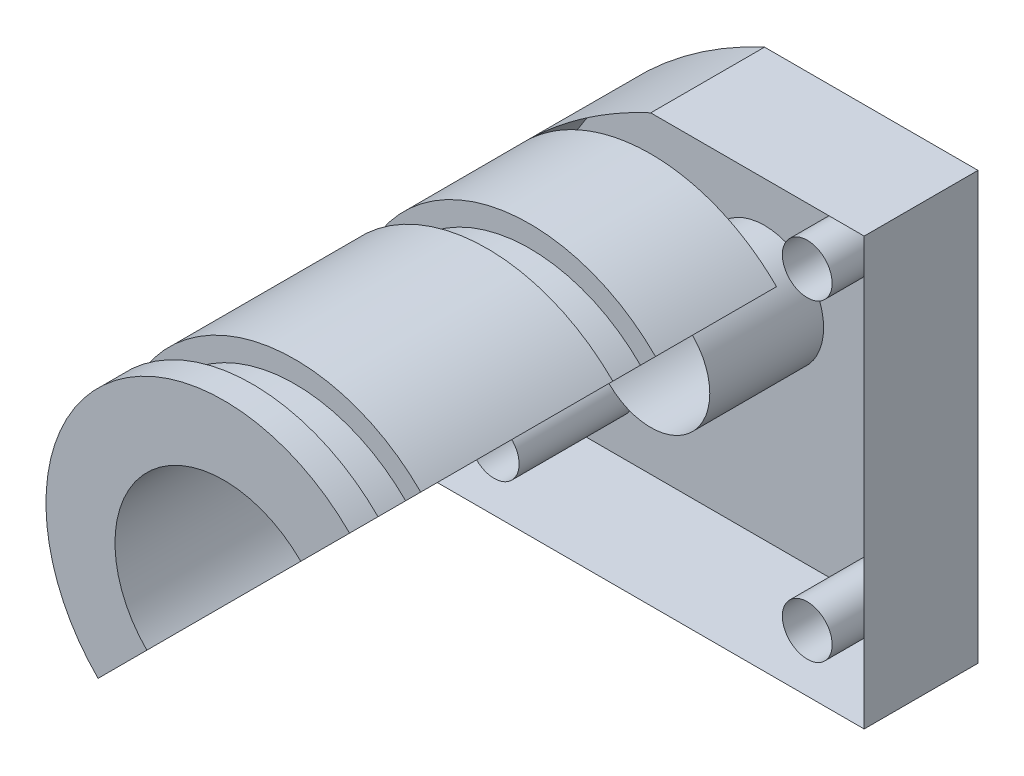
ISO-10303-21;
HEADER;
FILE_DESCRIPTION(('STEP AP214'),'2;1');
FILE_NAME('part.step','',(''),(''),'','','');
FILE_SCHEMA(('AUTOMOTIVE_DESIGN { 1 0 10303 214 1 1 1 1 }'));
ENDSEC;
DATA;
#1=APPLICATION_CONTEXT('core data for automotive mechanical design processes');
#2=APPLICATION_PROTOCOL_DEFINITION('international standard','automotive_design',2000,#1);
#3=PRODUCT_CONTEXT('',#1,'mechanical');
#4=PRODUCT('Part','Part','',(#3));
#5=PRODUCT_RELATED_PRODUCT_CATEGORY('part','',(#4));
#6=PRODUCT_DEFINITION_FORMATION('','',#4);
#7=PRODUCT_DEFINITION_CONTEXT('part definition',#1,'design');
#8=PRODUCT_DEFINITION('design','',#6,#7);
#9=PRODUCT_DEFINITION_SHAPE('','',#8);
#10=(LENGTH_UNIT() NAMED_UNIT(*) SI_UNIT(.MILLI.,.METRE.));
#11=(NAMED_UNIT(*) PLANE_ANGLE_UNIT() SI_UNIT($,.RADIAN.));
#12=(NAMED_UNIT(*) SI_UNIT($,.STERADIAN.) SOLID_ANGLE_UNIT());
#13=UNCERTAINTY_MEASURE_WITH_UNIT(LENGTH_MEASURE(1.E-05),#10,'distance_accuracy_value','');
#14=(GEOMETRIC_REPRESENTATION_CONTEXT(3) GLOBAL_UNCERTAINTY_ASSIGNED_CONTEXT((#13)) GLOBAL_UNIT_ASSIGNED_CONTEXT((#10,
#11,#12)) REPRESENTATION_CONTEXT('',''));
#15=CARTESIAN_POINT('',(0.,0.,0.));
#16=DIRECTION('',(0.,0.,1.));
#17=DIRECTION('',(1.,0.,0.));
#18=AXIS2_PLACEMENT_3D('',#15,#16,#17);
#19=CARTESIAN_POINT('',(15.,15.,38.));
#20=DIRECTION('',(0.,0.,-1.));
#21=DIRECTION('',(-1.,0.,0.));
#22=AXIS2_PLACEMENT_3D('',#19,#20,#21);
#23=CYLINDRICAL_SURFACE('',#22,12.5);
#24=CARTESIAN_POINT('',(15.,15.,16.5));
#25=DIRECTION('',(0.,0.,1.));
#26=DIRECTION('',(1.,0.,0.));
#27=AXIS2_PLACEMENT_3D('',#24,#25,#26);
#28=CIRCLE('',#27,12.5);
#29=CARTESIAN_POINT('',(23.8388347648318,23.8388347648318,16.5));
#30=VERTEX_POINT('',#29);
#31=CARTESIAN_POINT('',(6.16116523516816,6.16116523516815,16.5));
#32=VERTEX_POINT('',#31);
#33=EDGE_CURVE('E171',#30,#32,#28,.T.);
#34=ORIENTED_EDGE('',*,*,#33,.F.);
#35=DIRECTION('',(0.,0.,-1.));
#36=VECTOR('',#35,1.);
#37=CARTESIAN_POINT('',(23.8388347648318,23.8388347648318,38.));
#38=LINE('',#37,#36);
#39=CARTESIAN_POINT('',(23.8388347648318,23.8388347648318,8.));
#40=VERTEX_POINT('',#39);
#41=EDGE_CURVE('E260',#30,#40,#38,.T.);
#42=ORIENTED_EDGE('',*,*,#41,.T.);
#43=CARTESIAN_POINT('',(15.,15.,8.));
#44=DIRECTION('',(0.,0.,1.));
#45=DIRECTION('',(-1.,0.,0.));
#46=AXIS2_PLACEMENT_3D('',#43,#44,#45);
#47=CIRCLE('',#46,12.5);
#48=CARTESIAN_POINT('',(6.16116523516816,23.8388347648318,8.));
#49=VERTEX_POINT('',#48);
#50=EDGE_CURVE('E296',#40,#49,#47,.T.);
#51=ORIENTED_EDGE('',*,*,#50,.T.);
#52=CARTESIAN_POINT('',(6.16116523516816,6.16116523516815,8.));
#53=VERTEX_POINT('',#52);
#54=EDGE_CURVE('E299',#49,#53,#47,.T.);
#55=ORIENTED_EDGE('',*,*,#54,.T.);
#56=DIRECTION('',(0.,0.,-1.));
#57=VECTOR('',#56,1.);
#58=CARTESIAN_POINT('',(6.16116523516816,6.16116523516815,38.));
#59=LINE('',#58,#57);
#60=EDGE_CURVE('E179',#32,#53,#59,.T.);
#61=ORIENTED_EDGE('',*,*,#60,.F.);
#62=EDGE_LOOP('',(#34,#42,#51,#55,#61));
#63=FACE_BOUND('',#62,.T.);
#64=ADVANCED_FACE('F33',(#63),#23,.T.);
#65=CARTESIAN_POINT('',(15.,15.,19.5));
#66=DIRECTION('',(0.,0.,1.));
#67=DIRECTION('',(1.,0.,0.));
#68=AXIS2_PLACEMENT_3D('',#65,#66,#67);
#69=CIRCLE('',#68,12.5);
#70=CARTESIAN_POINT('',(23.8388347648318,23.8388347648318,19.5));
#71=VERTEX_POINT('',#70);
#72=CARTESIAN_POINT('',(6.16116523516816,6.16116523516815,19.5));
#73=VERTEX_POINT('',#72);
#74=EDGE_CURVE('E48',#71,#73,#69,.T.);
#75=ORIENTED_EDGE('',*,*,#74,.T.);
#76=CARTESIAN_POINT('',(6.16116523516816,6.16116523516815,33.));
#77=VERTEX_POINT('',#76);
#78=EDGE_CURVE('E168',#77,#73,#59,.T.);
#79=ORIENTED_EDGE('',*,*,#78,.F.);
#80=CARTESIAN_POINT('',(15.,15.,33.));
#81=DIRECTION('',(0.,0.,1.));
#82=DIRECTION('',(1.,0.,0.));
#83=AXIS2_PLACEMENT_3D('',#80,#81,#82);
#84=CIRCLE('',#83,12.5);
#85=CARTESIAN_POINT('',(23.8388347648318,23.8388347648318,33.));
#86=VERTEX_POINT('',#85);
#87=EDGE_CURVE('E547',#86,#77,#84,.T.);
#88=ORIENTED_EDGE('',*,*,#87,.F.);
#89=EDGE_CURVE('E170',#86,#71,#38,.T.);
#90=ORIENTED_EDGE('',*,*,#89,.T.);
#91=EDGE_LOOP('',(#75,#79,#88,#90));
#92=FACE_BOUND('',#91,.T.);
#93=ADVANCED_FACE('F166',(#92),#23,.T.);
#94=CARTESIAN_POINT('',(6.16116523516816,6.16116523516815,38.));
#95=DIRECTION('',(-0.707106781186549,0.707106781186546,0.));
#96=DIRECTION('',(-0.707106781186546,-0.707106781186549,0.));
#97=AXIS2_PLACEMENT_3D('',#94,#95,#96);
#98=PLANE('',#97);
#99=DIRECTION('',(0.707106781186546,0.707106781186549,0.));
#100=VECTOR('',#99,1.);
#101=CARTESIAN_POINT('',(6.16116523516816,6.16116523516815,16.5));
#102=LINE('',#101,#100);
#103=CARTESIAN_POINT('',(7.22182540694798,7.22182540694797,16.5));
#104=VERTEX_POINT('',#103);
#105=EDGE_CURVE('E255',#32,#104,#102,.T.);
#106=ORIENTED_EDGE('',*,*,#105,.F.);
#107=ORIENTED_EDGE('',*,*,#60,.T.);
#108=DIRECTION('',(0.707106781186546,0.707106781186549,0.));
#109=VECTOR('',#108,1.);
#110=CARTESIAN_POINT('',(6.16116523516816,6.16116523516815,8.));
#111=LINE('',#110,#109);
#112=CARTESIAN_POINT('',(9.59063312392291,9.59063312392291,8.));
#113=VERTEX_POINT('',#112);
#114=EDGE_CURVE('E291',#53,#113,#111,.T.);
#115=ORIENTED_EDGE('',*,*,#114,.T.);
#116=DIRECTION('',(0.,0.,-1.));
#117=VECTOR('',#116,1.);
#118=CARTESIAN_POINT('',(9.59063312392291,9.59063312392291,38.));
#119=LINE('',#118,#117);
#120=CARTESIAN_POINT('',(9.59063312392291,9.59063312392291,38.));
#121=VERTEX_POINT('',#120);
#122=EDGE_CURVE('E183',#121,#113,#119,.T.);
#123=ORIENTED_EDGE('',*,*,#122,.F.);
#124=DIRECTION('',(0.707106781186546,0.707106781186549,0.));
#125=VECTOR('',#124,1.);
#126=CARTESIAN_POINT('',(6.16116523516816,6.16116523516815,38.));
#127=LINE('',#126,#125);
#128=CARTESIAN_POINT('',(6.16116523516816,6.16116523516815,38.));
#129=VERTEX_POINT('',#128);
#130=EDGE_CURVE('E288',#129,#121,#127,.T.);
#131=ORIENTED_EDGE('',*,*,#130,.F.);
#132=CARTESIAN_POINT('',(6.16116523516816,6.16116523516815,36.));
#133=VERTEX_POINT('',#132);
#134=EDGE_CURVE('E178',#129,#133,#59,.T.);
#135=ORIENTED_EDGE('',*,*,#134,.T.);
#136=DIRECTION('',(-0.707106781186546,-0.707106781186549,0.));
#137=VECTOR('',#136,1.);
#138=CARTESIAN_POINT('',(6.16116523516816,6.16116523516815,36.));
#139=LINE('',#138,#137);
#140=CARTESIAN_POINT('',(7.22182540694798,7.22182540694797,36.));
#141=VERTEX_POINT('',#140);
#142=EDGE_CURVE('E316',#141,#133,#139,.T.);
#143=ORIENTED_EDGE('',*,*,#142,.F.);
#144=DIRECTION('',(0.,0.,1.));
#145=VECTOR('',#144,1.);
#146=CARTESIAN_POINT('',(7.22182540694798,7.22182540694798,42.3212421237054));
#147=LINE('',#146,#145);
#148=CARTESIAN_POINT('',(7.22182540694798,7.22182540694798,33.));
#149=VERTEX_POINT('',#148);
#150=EDGE_CURVE('E317',#149,#141,#147,.T.);
#151=ORIENTED_EDGE('',*,*,#150,.F.);
#152=DIRECTION('',(0.707106781186546,0.707106781186549,0.));
#153=VECTOR('',#152,1.);
#154=CARTESIAN_POINT('',(6.16116523516816,6.16116523516815,33.));
#155=LINE('',#154,#153);
#156=EDGE_CURVE('E177',#77,#149,#155,.T.);
#157=ORIENTED_EDGE('',*,*,#156,.F.);
#158=ORIENTED_EDGE('',*,*,#78,.T.);
#159=DIRECTION('',(-0.707106781186546,-0.707106781186549,0.));
#160=VECTOR('',#159,1.);
#161=CARTESIAN_POINT('',(6.16116523516816,6.16116523516815,19.5));
#162=LINE('',#161,#160);
#163=CARTESIAN_POINT('',(7.22182540694798,7.22182540694798,19.5));
#164=VERTEX_POINT('',#163);
#165=EDGE_CURVE('E153',#164,#73,#162,.T.);
#166=ORIENTED_EDGE('',*,*,#165,.F.);
#167=DIRECTION('',(0.,0.,1.));
#168=VECTOR('',#167,1.);
#169=CARTESIAN_POINT('',(7.22182540694798,7.22182540694798,42.3212421237054));
#170=LINE('',#169,#168);
#171=EDGE_CURVE('E160',#104,#164,#170,.T.);
#172=ORIENTED_EDGE('',*,*,#171,.F.);
#173=EDGE_LOOP('',(#106,#107,#115,#123,#131,#135,#143,#151,#157,#158,#166,#172));
#174=FACE_BOUND('',#173,.T.);
#175=ADVANCED_FACE('F175',(#174),#98,.F.);
#176=CARTESIAN_POINT('',(20.4093668760771,20.4093668760771,38.));
#177=DIRECTION('',(-0.707106781186547,0.707106781186548,0.));
#178=DIRECTION('',(-0.707106781186548,-0.707106781186547,0.));
#179=AXIS2_PLACEMENT_3D('',#176,#177,#178);
#180=PLANE('',#179);
#181=DIRECTION('',(0.707106781186548,0.707106781186547,0.));
#182=VECTOR('',#181,1.);
#183=CARTESIAN_POINT('',(20.4093668760771,20.4093668760771,16.5));
#184=LINE('',#183,#182);
#185=CARTESIAN_POINT('',(22.778174593052,22.778174593052,16.5));
#186=VERTEX_POINT('',#185);
#187=EDGE_CURVE('E11',#186,#30,#184,.T.);
#188=ORIENTED_EDGE('',*,*,#187,.F.);
#189=DIRECTION('',(0.,0.,1.));
#190=VECTOR('',#189,1.);
#191=CARTESIAN_POINT('',(22.778174593052,22.778174593052,42.3212421237054));
#192=LINE('',#191,#190);
#193=CARTESIAN_POINT('',(22.778174593052,22.778174593052,19.5));
#194=VERTEX_POINT('',#193);
#195=EDGE_CURVE('E41',#194,#186,#192,.F.);
#196=ORIENTED_EDGE('',*,*,#195,.F.);
#197=DIRECTION('',(-0.707106781186548,-0.707106781186547,0.));
#198=VECTOR('',#197,1.);
#199=CARTESIAN_POINT('',(20.4093668760771,20.4093668760771,19.5));
#200=LINE('',#199,#198);
#201=EDGE_CURVE('E244',#71,#194,#200,.T.);
#202=ORIENTED_EDGE('',*,*,#201,.F.);
#203=ORIENTED_EDGE('',*,*,#89,.F.);
#204=DIRECTION('',(0.707106781186548,0.707106781186547,0.));
#205=VECTOR('',#204,1.);
#206=CARTESIAN_POINT('',(20.4093668760771,20.4093668760771,33.));
#207=LINE('',#206,#205);
#208=CARTESIAN_POINT('',(22.778174593052,22.778174593052,33.));
#209=VERTEX_POINT('',#208);
#210=EDGE_CURVE('E233',#209,#86,#207,.T.);
#211=ORIENTED_EDGE('',*,*,#210,.F.);
#212=DIRECTION('',(0.,0.,1.));
#213=VECTOR('',#212,1.);
#214=CARTESIAN_POINT('',(22.778174593052,22.778174593052,42.3212421237054));
#215=LINE('',#214,#213);
#216=CARTESIAN_POINT('',(22.778174593052,22.778174593052,36.));
#217=VERTEX_POINT('',#216);
#218=EDGE_CURVE('E240',#217,#209,#215,.F.);
#219=ORIENTED_EDGE('',*,*,#218,.F.);
#220=DIRECTION('',(-0.707106781186548,-0.707106781186547,0.));
#221=VECTOR('',#220,1.);
#222=CARTESIAN_POINT('',(20.4093668760771,20.4093668760771,36.));
#223=LINE('',#222,#221);
#224=CARTESIAN_POINT('',(23.8388347648318,23.8388347648318,36.));
#225=VERTEX_POINT('',#224);
#226=EDGE_CURVE('E242',#225,#217,#223,.T.);
#227=ORIENTED_EDGE('',*,*,#226,.F.);
#228=CARTESIAN_POINT('',(23.8388347648318,23.8388347648318,38.));
#229=VERTEX_POINT('',#228);
#230=EDGE_CURVE('E268',#229,#225,#38,.T.);
#231=ORIENTED_EDGE('',*,*,#230,.F.);
#232=DIRECTION('',(0.707106781186548,0.707106781186547,0.));
#233=VECTOR('',#232,1.);
#234=CARTESIAN_POINT('',(20.4093668760771,20.4093668760771,38.));
#235=LINE('',#234,#233);
#236=CARTESIAN_POINT('',(20.4093668760771,20.4093668760771,38.));
#237=VERTEX_POINT('',#236);
#238=EDGE_CURVE('E266',#237,#229,#235,.T.);
#239=ORIENTED_EDGE('',*,*,#238,.F.);
#240=DIRECTION('',(0.,0.,-1.));
#241=VECTOR('',#240,1.);
#242=CARTESIAN_POINT('',(20.4093668760771,20.4093668760771,38.));
#243=LINE('',#242,#241);
#244=CARTESIAN_POINT('',(20.4093668760771,20.4093668760771,8.));
#245=VERTEX_POINT('',#244);
#246=EDGE_CURVE('E273',#237,#245,#243,.T.);
#247=ORIENTED_EDGE('',*,*,#246,.T.);
#248=DIRECTION('',(0.707106781186548,0.707106781186547,0.));
#249=VECTOR('',#248,1.);
#250=CARTESIAN_POINT('',(20.4093668760771,20.4093668760771,8.));
#251=LINE('',#250,#249);
#252=EDGE_CURVE('E262',#245,#40,#251,.T.);
#253=ORIENTED_EDGE('',*,*,#252,.T.);
#254=ORIENTED_EDGE('',*,*,#41,.F.);
#255=EDGE_LOOP('',(#188,#196,#202,#203,#211,#219,#227,#231,#239,#247,#253,#254));
#256=FACE_BOUND('',#255,.T.);
#257=ADVANCED_FACE('F258',(#256),#180,.F.);
#258=CARTESIAN_POINT('',(15.,15.,36.));
#259=DIRECTION('',(0.,0.,1.));
#260=DIRECTION('',(1.,0.,0.));
#261=AXIS2_PLACEMENT_3D('',#258,#259,#260);
#262=CIRCLE('',#261,12.5);
#263=EDGE_CURVE('E314',#225,#133,#262,.T.);
#264=ORIENTED_EDGE('',*,*,#263,.T.);
#265=ORIENTED_EDGE('',*,*,#134,.F.);
#266=CARTESIAN_POINT('',(15.,15.,38.));
#267=DIRECTION('',(0.,0.,1.));
#268=DIRECTION('',(-1.,0.,0.));
#269=AXIS2_PLACEMENT_3D('',#266,#267,#268);
#270=CIRCLE('',#269,12.5);
#271=EDGE_CURVE('E301',#229,#129,#270,.T.);
#272=ORIENTED_EDGE('',*,*,#271,.F.);
#273=ORIENTED_EDGE('',*,*,#230,.T.);
#274=EDGE_LOOP('',(#264,#265,#272,#273));
#275=FACE_BOUND('',#274,.T.);
#276=ADVANCED_FACE('F313',(#275),#23,.T.);
#277=CARTESIAN_POINT('',(0.,0.,8.));
#278=DIRECTION('',(0.,0.,-1.));
#279=DIRECTION('',(-1.,0.,0.));
#280=AXIS2_PLACEMENT_3D('',#277,#278,#279);
#281=PLANE('',#280);
#282=CARTESIAN_POINT('',(15.,15.,8.));
#283=DIRECTION('',(0.,0.,1.));
#284=DIRECTION('',(1.,0.,0.));
#285=AXIS2_PLACEMENT_3D('',#282,#283,#284);
#286=CIRCLE('',#285,4.15);
#287=CARTESIAN_POINT('',(19.15,15.,8.));
#288=VERTEX_POINT('',#287);
#289=EDGE_CURVE('E238',#288,#288,#286,.T.);
#290=ORIENTED_EDGE('',*,*,#289,.F.);
#291=EDGE_LOOP('',(#290));
#292=FACE_BOUND('',#291,.T.);
#293=CARTESIAN_POINT('',(26.,4.,8.));
#294=DIRECTION('',(0.,0.,1.));
#295=DIRECTION('',(1.,0.,0.));
#296=AXIS2_PLACEMENT_3D('',#293,#294,#295);
#297=CIRCLE('',#296,1.75);
#298=CARTESIAN_POINT('',(27.75,4.,8.));
#299=VERTEX_POINT('',#298);
#300=EDGE_CURVE('E182',#299,#299,#297,.T.);
#301=ORIENTED_EDGE('',*,*,#300,.F.);
#302=EDGE_LOOP('',(#301));
#303=FACE_BOUND('',#302,.T.);
#304=CARTESIAN_POINT('',(26.,26.,8.));
#305=DIRECTION('',(0.,0.,1.));
#306=DIRECTION('',(1.,0.,0.));
#307=AXIS2_PLACEMENT_3D('',#304,#305,#306);
#308=CIRCLE('',#307,1.75);
#309=CARTESIAN_POINT('',(27.75,26.,8.));
#310=VERTEX_POINT('',#309);
#311=EDGE_CURVE('E191',#310,#310,#308,.T.);
#312=ORIENTED_EDGE('',*,*,#311,.F.);
#313=EDGE_LOOP('',(#312));
#314=FACE_BOUND('',#313,.T.);
#315=CARTESIAN_POINT('',(4.,4.,8.));
#316=DIRECTION('',(0.,0.,1.));
#317=DIRECTION('',(1.,0.,0.));
#318=AXIS2_PLACEMENT_3D('',#315,#316,#317);
#319=CIRCLE('',#318,1.75);
#320=CARTESIAN_POINT('',(5.75,4.,8.));
#321=VERTEX_POINT('',#320);
#322=EDGE_CURVE('E187',#321,#321,#319,.T.);
#323=ORIENTED_EDGE('',*,*,#322,.F.);
#324=EDGE_LOOP('',(#323));
#325=FACE_BOUND('',#324,.T.);
#326=DIRECTION('',(-1.,0.,0.));
#327=VECTOR('',#326,1.);
#328=CARTESIAN_POINT('',(0.,30.,8.));
#329=LINE('',#328,#327);
#330=CARTESIAN_POINT('',(30.,30.,8.));
#331=VERTEX_POINT('',#330);
#332=CARTESIAN_POINT('',(15.,30.,8.));
#333=VERTEX_POINT('',#332);
#334=EDGE_CURVE('E203',#331,#333,#329,.T.);
#335=ORIENTED_EDGE('',*,*,#334,.T.);
#336=CARTESIAN_POINT('',(27.8376558866536,2.16234411334642,8.));
#337=DIRECTION('',(0.,0.,-1.));
#338=DIRECTION('',(-1.,0.,0.));
#339=AXIS2_PLACEMENT_3D('',#336,#337,#338);
#340=CIRCLE('',#339,30.6551870639843);
#341=EDGE_CURVE('E237',#49,#333,#340,.T.);
#342=ORIENTED_EDGE('',*,*,#341,.F.);
#343=ORIENTED_EDGE('',*,*,#50,.F.);
#344=ORIENTED_EDGE('',*,*,#252,.F.);
#345=CARTESIAN_POINT('',(15.,15.,8.));
#346=DIRECTION('',(0.,0.,-1.));
#347=DIRECTION('',(-1.,0.,0.));
#348=AXIS2_PLACEMENT_3D('',#345,#346,#347);
#349=CIRCLE('',#348,7.65);
#350=EDGE_CURVE('E286',#113,#245,#349,.T.);
#351=ORIENTED_EDGE('',*,*,#350,.F.);
#352=ORIENTED_EDGE('',*,*,#114,.F.);
#353=ORIENTED_EDGE('',*,*,#54,.F.);
#354=CARTESIAN_POINT('',(0.,15.,8.));
#355=VERTEX_POINT('',#354);
#356=EDGE_CURVE('E326',#355,#49,#340,.T.);
#357=ORIENTED_EDGE('',*,*,#356,.F.);
#358=DIRECTION('',(0.,-1.,0.));
#359=VECTOR('',#358,1.);
#360=CARTESIAN_POINT('',(0.,0.,8.));
#361=LINE('',#360,#359);
#362=CARTESIAN_POINT('',(0.,0.,8.));
#363=VERTEX_POINT('',#362);
#364=EDGE_CURVE('E196',#355,#363,#361,.T.);
#365=ORIENTED_EDGE('',*,*,#364,.T.);
#366=DIRECTION('',(1.,0.,0.));
#367=VECTOR('',#366,1.);
#368=CARTESIAN_POINT('',(0.,0.,8.));
#369=LINE('',#368,#367);
#370=CARTESIAN_POINT('',(30.,0.,8.));
#371=VERTEX_POINT('',#370);
#372=EDGE_CURVE('E198',#363,#371,#369,.T.);
#373=ORIENTED_EDGE('',*,*,#372,.T.);
#374=DIRECTION('',(0.,1.,0.));
#375=VECTOR('',#374,1.);
#376=CARTESIAN_POINT('',(30.,0.,8.));
#377=LINE('',#376,#375);
#378=EDGE_CURVE('E201',#371,#331,#377,.T.);
#379=ORIENTED_EDGE('',*,*,#378,.T.);
#380=EDGE_LOOP('',(#335,#342,#343,#344,#351,#352,#353,#357,#365,#373,#379));
#381=FACE_BOUND('',#380,.T.);
#382=ADVANCED_FACE('F338',(#292,#303,#314,#325,#381),#281,.F.);
#383=CARTESIAN_POINT('',(0.,0.,8.));
#384=DIRECTION('',(1.,0.,0.));
#385=DIRECTION('',(0.,0.,-1.));
#386=AXIS2_PLACEMENT_3D('',#383,#384,#385);
#387=PLANE('',#386);
#388=ORIENTED_EDGE('',*,*,#364,.F.);
#389=DIRECTION('',(0.,0.,1.));
#390=VECTOR('',#389,1.);
#391=CARTESIAN_POINT('',(0.,15.,-22.));
#392=LINE('',#391,#390);
#393=CARTESIAN_POINT('',(0.,15.,0.));
#394=VERTEX_POINT('',#393);
#395=EDGE_CURVE('E327',#394,#355,#392,.T.);
#396=ORIENTED_EDGE('',*,*,#395,.F.);
#397=DIRECTION('',(0.,-1.,0.));
#398=VECTOR('',#397,1.);
#399=CARTESIAN_POINT('',(0.,0.,0.));
#400=LINE('',#399,#398);
#401=CARTESIAN_POINT('',(0.,0.,0.));
#402=VERTEX_POINT('',#401);
#403=EDGE_CURVE('E207',#394,#402,#400,.T.);
#404=ORIENTED_EDGE('',*,*,#403,.T.);
#405=DIRECTION('',(0.,0.,-1.));
#406=VECTOR('',#405,1.);
#407=CARTESIAN_POINT('',(0.,0.,8.));
#408=LINE('',#407,#406);
#409=EDGE_CURVE('E221',#363,#402,#408,.T.);
#410=ORIENTED_EDGE('',*,*,#409,.F.);
#411=EDGE_LOOP('',(#388,#396,#404,#410));
#412=FACE_BOUND('',#411,.T.);
#413=ADVANCED_FACE('F35',(#412),#387,.F.);
#414=CARTESIAN_POINT('',(0.,0.,8.));
#415=DIRECTION('',(0.,1.,0.));
#416=DIRECTION('',(0.,0.,1.));
#417=AXIS2_PLACEMENT_3D('',#414,#415,#416);
#418=PLANE('',#417);
#419=DIRECTION('',(1.,0.,0.));
#420=VECTOR('',#419,1.);
#421=CARTESIAN_POINT('',(0.,0.,0.));
#422=LINE('',#421,#420);
#423=CARTESIAN_POINT('',(30.,0.,0.));
#424=VERTEX_POINT('',#423);
#425=EDGE_CURVE('E209',#402,#424,#422,.T.);
#426=ORIENTED_EDGE('',*,*,#425,.T.);
#427=DIRECTION('',(0.,0.,-1.));
#428=VECTOR('',#427,1.);
#429=CARTESIAN_POINT('',(30.,0.,8.));
#430=LINE('',#429,#428);
#431=EDGE_CURVE('E218',#371,#424,#430,.T.);
#432=ORIENTED_EDGE('',*,*,#431,.F.);
#433=ORIENTED_EDGE('',*,*,#372,.F.);
#434=ORIENTED_EDGE('',*,*,#409,.T.);
#435=EDGE_LOOP('',(#426,#432,#433,#434));
#436=FACE_BOUND('',#435,.T.);
#437=ADVANCED_FACE('F356',(#436),#418,.F.);
#438=CARTESIAN_POINT('',(30.,0.,8.));
#439=DIRECTION('',(-1.,0.,0.));
#440=DIRECTION('',(0.,-1.,0.));
#441=AXIS2_PLACEMENT_3D('',#438,#439,#440);
#442=PLANE('',#441);
#443=DIRECTION('',(0.,1.,0.));
#444=VECTOR('',#443,1.);
#445=CARTESIAN_POINT('',(30.,0.,0.));
#446=LINE('',#445,#444);
#447=CARTESIAN_POINT('',(30.,30.,0.));
#448=VERTEX_POINT('',#447);
#449=EDGE_CURVE('E212',#424,#448,#446,.T.);
#450=ORIENTED_EDGE('',*,*,#449,.T.);
#451=DIRECTION('',(0.,0.,-1.));
#452=VECTOR('',#451,1.);
#453=CARTESIAN_POINT('',(30.,30.,8.));
#454=LINE('',#453,#452);
#455=EDGE_CURVE('E206',#331,#448,#454,.T.);
#456=ORIENTED_EDGE('',*,*,#455,.F.);
#457=ORIENTED_EDGE('',*,*,#378,.F.);
#458=ORIENTED_EDGE('',*,*,#431,.T.);
#459=EDGE_LOOP('',(#450,#456,#457,#458));
#460=FACE_BOUND('',#459,.T.);
#461=ADVANCED_FACE('F344',(#460),#442,.F.);
#462=CARTESIAN_POINT('',(0.,30.,8.));
#463=DIRECTION('',(0.,-1.,0.));
#464=DIRECTION('',(0.,0.,-1.));
#465=AXIS2_PLACEMENT_3D('',#462,#463,#464);
#466=PLANE('',#465);
#467=DIRECTION('',(-1.,0.,0.));
#468=VECTOR('',#467,1.);
#469=CARTESIAN_POINT('',(0.,30.,0.));
#470=LINE('',#469,#468);
#471=CARTESIAN_POINT('',(15.,30.,0.));
#472=VERTEX_POINT('',#471);
#473=EDGE_CURVE('E199',#448,#472,#470,.T.);
#474=ORIENTED_EDGE('',*,*,#473,.T.);
#475=DIRECTION('',(0.,0.,1.));
#476=VECTOR('',#475,1.);
#477=CARTESIAN_POINT('',(15.,30.,-22.));
#478=LINE('',#477,#476);
#479=EDGE_CURVE('E307',#472,#333,#478,.T.);
#480=ORIENTED_EDGE('',*,*,#479,.T.);
#481=ORIENTED_EDGE('',*,*,#334,.F.);
#482=ORIENTED_EDGE('',*,*,#455,.T.);
#483=EDGE_LOOP('',(#474,#480,#481,#482));
#484=FACE_BOUND('',#483,.T.);
#485=ADVANCED_FACE('F334',(#484),#466,.F.);
#486=CARTESIAN_POINT('',(0.,0.,0.));
#487=DIRECTION('',(0.,0.,-1.));
#488=DIRECTION('',(-1.,0.,0.));
#489=AXIS2_PLACEMENT_3D('',#486,#487,#488);
#490=PLANE('',#489);
#491=CARTESIAN_POINT('',(15.,15.,0.));
#492=DIRECTION('',(0.,0.,-1.));
#493=DIRECTION('',(-1.,0.,0.));
#494=AXIS2_PLACEMENT_3D('',#491,#492,#493);
#495=CIRCLE('',#494,4.15);
#496=CARTESIAN_POINT('',(10.85,15.,0.));
#497=VERTEX_POINT('',#496);
#498=EDGE_CURVE('E234',#497,#497,#495,.T.);
#499=ORIENTED_EDGE('',*,*,#498,.F.);
#500=EDGE_LOOP('',(#499));
#501=FACE_BOUND('',#500,.T.);
#502=CARTESIAN_POINT('',(27.8376558866536,2.16234411334642,0.));
#503=DIRECTION('',(0.,0.,-1.));
#504=DIRECTION('',(-1.,0.,0.));
#505=AXIS2_PLACEMENT_3D('',#502,#503,#504);
#506=CIRCLE('',#505,30.6551870639843);
#507=EDGE_CURVE('E224',#472,#394,#506,.F.);
#508=ORIENTED_EDGE('',*,*,#507,.F.);
#509=ORIENTED_EDGE('',*,*,#473,.F.);
#510=ORIENTED_EDGE('',*,*,#449,.F.);
#511=ORIENTED_EDGE('',*,*,#425,.F.);
#512=ORIENTED_EDGE('',*,*,#403,.F.);
#513=EDGE_LOOP('',(#508,#509,#510,#511,#512));
#514=FACE_BOUND('',#513,.T.);
#515=CARTESIAN_POINT('',(4.,4.,0.));
#516=DIRECTION('',(0.,0.,-1.));
#517=DIRECTION('',(-1.,0.,0.));
#518=AXIS2_PLACEMENT_3D('',#515,#516,#517);
#519=CIRCLE('',#518,1.75);
#520=CARTESIAN_POINT('',(2.25,4.,0.));
#521=VERTEX_POINT('',#520);
#522=EDGE_CURVE('E210',#521,#521,#519,.T.);
#523=ORIENTED_EDGE('',*,*,#522,.F.);
#524=EDGE_LOOP('',(#523));
#525=FACE_BOUND('',#524,.T.);
#526=CARTESIAN_POINT('',(26.,26.,0.));
#527=DIRECTION('',(0.,0.,-1.));
#528=DIRECTION('',(-1.,0.,0.));
#529=AXIS2_PLACEMENT_3D('',#526,#527,#528);
#530=CIRCLE('',#529,1.75);
#531=CARTESIAN_POINT('',(24.25,26.,0.));
#532=VERTEX_POINT('',#531);
#533=EDGE_CURVE('E227',#532,#532,#530,.T.);
#534=ORIENTED_EDGE('',*,*,#533,.F.);
#535=EDGE_LOOP('',(#534));
#536=FACE_BOUND('',#535,.T.);
#537=CARTESIAN_POINT('',(26.,4.,0.));
#538=DIRECTION('',(0.,0.,-1.));
#539=DIRECTION('',(-1.,0.,0.));
#540=AXIS2_PLACEMENT_3D('',#537,#538,#539);
#541=CIRCLE('',#540,1.75);
#542=CARTESIAN_POINT('',(24.25,4.,0.));
#543=VERTEX_POINT('',#542);
#544=EDGE_CURVE('E190',#543,#543,#541,.T.);
#545=ORIENTED_EDGE('',*,*,#544,.F.);
#546=EDGE_LOOP('',(#545));
#547=FACE_BOUND('',#546,.T.);
#548=ADVANCED_FACE('F347',(#501,#514,#525,#536,#547),#490,.T.);
#549=CARTESIAN_POINT('',(26.,4.,-22.));
#550=DIRECTION('',(0.,0.,1.));
#551=DIRECTION('',(1.,0.,0.));
#552=AXIS2_PLACEMENT_3D('',#549,#550,#551);
#553=CYLINDRICAL_SURFACE('',#552,1.75);
#554=ORIENTED_EDGE('',*,*,#544,.T.);
#555=EDGE_LOOP('',(#554));
#556=FACE_BOUND('',#555,.T.);
#557=ORIENTED_EDGE('',*,*,#300,.T.);
#558=EDGE_LOOP('',(#557));
#559=FACE_BOUND('',#558,.T.);
#560=ADVANCED_FACE('F395',(#556,#559),#553,.F.);
#561=CARTESIAN_POINT('',(26.,26.,-22.));
#562=DIRECTION('',(0.,0.,1.));
#563=DIRECTION('',(1.,0.,0.));
#564=AXIS2_PLACEMENT_3D('',#561,#562,#563);
#565=CYLINDRICAL_SURFACE('',#564,1.75);
#566=ORIENTED_EDGE('',*,*,#533,.T.);
#567=EDGE_LOOP('',(#566));
#568=FACE_BOUND('',#567,.T.);
#569=ORIENTED_EDGE('',*,*,#311,.T.);
#570=EDGE_LOOP('',(#569));
#571=FACE_BOUND('',#570,.T.);
#572=ADVANCED_FACE('F390',(#568,#571),#565,.F.);
#573=CARTESIAN_POINT('',(4.,4.,-22.));
#574=DIRECTION('',(0.,0.,1.));
#575=DIRECTION('',(1.,0.,0.));
#576=AXIS2_PLACEMENT_3D('',#573,#574,#575);
#577=CYLINDRICAL_SURFACE('',#576,1.75);
#578=ORIENTED_EDGE('',*,*,#522,.T.);
#579=EDGE_LOOP('',(#578));
#580=FACE_BOUND('',#579,.T.);
#581=ORIENTED_EDGE('',*,*,#322,.T.);
#582=EDGE_LOOP('',(#581));
#583=FACE_BOUND('',#582,.T.);
#584=ADVANCED_FACE('F385',(#580,#583),#577,.F.);
#585=CARTESIAN_POINT('',(15.,15.,38.));
#586=DIRECTION('',(0.,0.,-1.));
#587=DIRECTION('',(-1.,0.,0.));
#588=AXIS2_PLACEMENT_3D('',#585,#586,#587);
#589=CYLINDRICAL_SURFACE('',#588,7.65);
#590=ORIENTED_EDGE('',*,*,#350,.T.);
#591=ORIENTED_EDGE('',*,*,#246,.F.);
#592=CARTESIAN_POINT('',(15.,15.,38.));
#593=DIRECTION('',(0.,0.,-1.));
#594=DIRECTION('',(-1.,0.,0.));
#595=AXIS2_PLACEMENT_3D('',#592,#593,#594);
#596=CIRCLE('',#595,7.65);
#597=EDGE_CURVE('E269',#121,#237,#596,.T.);
#598=ORIENTED_EDGE('',*,*,#597,.F.);
#599=ORIENTED_EDGE('',*,*,#122,.T.);
#600=EDGE_LOOP('',(#590,#591,#598,#599));
#601=FACE_BOUND('',#600,.T.);
#602=ADVANCED_FACE('F285',(#601),#589,.F.);
#603=CARTESIAN_POINT('',(15.,15.,38.));
#604=DIRECTION('',(0.,0.,-1.));
#605=DIRECTION('',(-1.,0.,0.));
#606=AXIS2_PLACEMENT_3D('',#603,#604,#605);
#607=PLANE('',#606);
#608=ORIENTED_EDGE('',*,*,#271,.T.);
#609=ORIENTED_EDGE('',*,*,#130,.T.);
#610=ORIENTED_EDGE('',*,*,#597,.T.);
#611=ORIENTED_EDGE('',*,*,#238,.T.);
#612=EDGE_LOOP('',(#608,#609,#610,#611));
#613=FACE_BOUND('',#612,.T.);
#614=ADVANCED_FACE('F310',(#613),#607,.F.);
#615=CARTESIAN_POINT('',(27.8376558866536,2.16234411334642,-22.));
#616=DIRECTION('',(0.,0.,1.));
#617=DIRECTION('',(1.,0.,0.));
#618=AXIS2_PLACEMENT_3D('',#615,#616,#617);
#619=CYLINDRICAL_SURFACE('',#618,30.6551870639843);
#620=ORIENTED_EDGE('',*,*,#507,.T.);
#621=ORIENTED_EDGE('',*,*,#395,.T.);
#622=ORIENTED_EDGE('',*,*,#356,.T.);
#623=ORIENTED_EDGE('',*,*,#341,.T.);
#624=ORIENTED_EDGE('',*,*,#479,.F.);
#625=EDGE_LOOP('',(#620,#621,#622,#623,#624));
#626=FACE_BOUND('',#625,.T.);
#627=ADVANCED_FACE('F351',(#626),#619,.T.);
#628=CARTESIAN_POINT('',(15.,15.,-22.));
#629=DIRECTION('',(0.,0.,1.));
#630=DIRECTION('',(1.,0.,0.));
#631=AXIS2_PLACEMENT_3D('',#628,#629,#630);
#632=CYLINDRICAL_SURFACE('',#631,4.15);
#633=ORIENTED_EDGE('',*,*,#498,.T.);
#634=EDGE_LOOP('',(#633));
#635=FACE_BOUND('',#634,.T.);
#636=ORIENTED_EDGE('',*,*,#289,.T.);
#637=EDGE_LOOP('',(#636));
#638=FACE_BOUND('',#637,.T.);
#639=ADVANCED_FACE('F459',(#635,#638),#632,.F.);
#640=CARTESIAN_POINT('',(23.8388347648319,23.8388347648318,36.));
#641=DIRECTION('',(0.,0.,-1.));
#642=DIRECTION('',(-1.,0.,0.));
#643=AXIS2_PLACEMENT_3D('',#640,#641,#642);
#644=PLANE('',#643);
#645=ORIENTED_EDGE('',*,*,#142,.T.);
#646=ORIENTED_EDGE('',*,*,#263,.F.);
#647=ORIENTED_EDGE('',*,*,#226,.T.);
#648=CARTESIAN_POINT('',(15.,15.,36.));
#649=DIRECTION('',(0.,0.,1.));
#650=DIRECTION('',(1.,0.,0.));
#651=AXIS2_PLACEMENT_3D('',#648,#649,#650);
#652=CIRCLE('',#651,11.);
#653=EDGE_CURVE('E548',#217,#141,#652,.T.);
#654=ORIENTED_EDGE('',*,*,#653,.T.);
#655=EDGE_LOOP('',(#645,#646,#647,#654));
#656=FACE_BOUND('',#655,.T.);
#657=ADVANCED_FACE('F467',(#656),#644,.T.);
#658=CARTESIAN_POINT('',(15.,15.,42.3212421237054));
#659=DIRECTION('',(0.,0.,1.));
#660=DIRECTION('',(1.,0.,0.));
#661=AXIS2_PLACEMENT_3D('',#658,#659,#660);
#662=CYLINDRICAL_SURFACE('',#661,11.);
#663=ORIENTED_EDGE('',*,*,#150,.T.);
#664=ORIENTED_EDGE('',*,*,#653,.F.);
#665=ORIENTED_EDGE('',*,*,#218,.T.);
#666=CARTESIAN_POINT('',(15.,15.,33.));
#667=DIRECTION('',(0.,0.,1.));
#668=DIRECTION('',(1.,0.,0.));
#669=AXIS2_PLACEMENT_3D('',#666,#667,#668);
#670=CIRCLE('',#669,11.);
#671=EDGE_CURVE('E56',#209,#149,#670,.T.);
#672=ORIENTED_EDGE('',*,*,#671,.T.);
#673=EDGE_LOOP('',(#663,#664,#665,#672));
#674=FACE_BOUND('',#673,.T.);
#675=ADVANCED_FACE('F474',(#674),#662,.T.);
#676=CARTESIAN_POINT('',(23.8388347648319,23.8388347648318,33.));
#677=DIRECTION('',(0.,0.,1.));
#678=DIRECTION('',(1.,0.,0.));
#679=AXIS2_PLACEMENT_3D('',#676,#677,#678);
#680=PLANE('',#679);
#681=ORIENTED_EDGE('',*,*,#156,.T.);
#682=ORIENTED_EDGE('',*,*,#671,.F.);
#683=ORIENTED_EDGE('',*,*,#210,.T.);
#684=ORIENTED_EDGE('',*,*,#87,.T.);
#685=EDGE_LOOP('',(#681,#682,#683,#684));
#686=FACE_BOUND('',#685,.T.);
#687=ADVANCED_FACE('F481',(#686),#680,.T.);
#688=CARTESIAN_POINT('',(23.8388347648319,23.8388347648318,16.5));
#689=DIRECTION('',(0.,0.,1.));
#690=DIRECTION('',(1.,0.,0.));
#691=AXIS2_PLACEMENT_3D('',#688,#689,#690);
#692=PLANE('',#691);
#693=ORIENTED_EDGE('',*,*,#105,.T.);
#694=CARTESIAN_POINT('',(15.,15.,16.5));
#695=DIRECTION('',(0.,0.,1.));
#696=DIRECTION('',(1.,0.,0.));
#697=AXIS2_PLACEMENT_3D('',#694,#695,#696);
#698=CIRCLE('',#697,11.);
#699=EDGE_CURVE('E161',#186,#104,#698,.T.);
#700=ORIENTED_EDGE('',*,*,#699,.F.);
#701=ORIENTED_EDGE('',*,*,#187,.T.);
#702=ORIENTED_EDGE('',*,*,#33,.T.);
#703=EDGE_LOOP('',(#693,#700,#701,#702));
#704=FACE_BOUND('',#703,.T.);
#705=ADVANCED_FACE('F253',(#704),#692,.T.);
#706=CARTESIAN_POINT('',(15.,15.,42.3212421237054));
#707=DIRECTION('',(0.,0.,1.));
#708=DIRECTION('',(1.,0.,0.));
#709=AXIS2_PLACEMENT_3D('',#706,#707,#708);
#710=CYLINDRICAL_SURFACE('',#709,11.);
#711=ORIENTED_EDGE('',*,*,#171,.T.);
#712=CARTESIAN_POINT('',(15.,15.,19.5));
#713=DIRECTION('',(0.,0.,1.));
#714=DIRECTION('',(1.,0.,0.));
#715=AXIS2_PLACEMENT_3D('',#712,#713,#714);
#716=CIRCLE('',#715,11.);
#717=EDGE_CURVE('E156',#194,#164,#716,.T.);
#718=ORIENTED_EDGE('',*,*,#717,.F.);
#719=ORIENTED_EDGE('',*,*,#195,.T.);
#720=ORIENTED_EDGE('',*,*,#699,.T.);
#721=EDGE_LOOP('',(#711,#718,#719,#720));
#722=FACE_BOUND('',#721,.T.);
#723=ADVANCED_FACE('F249',(#722),#710,.T.);
#724=CARTESIAN_POINT('',(23.8388347648319,23.8388347648318,19.5));
#725=DIRECTION('',(0.,0.,-1.));
#726=DIRECTION('',(-1.,0.,0.));
#727=AXIS2_PLACEMENT_3D('',#724,#725,#726);
#728=PLANE('',#727);
#729=ORIENTED_EDGE('',*,*,#165,.T.);
#730=ORIENTED_EDGE('',*,*,#74,.F.);
#731=ORIENTED_EDGE('',*,*,#201,.T.);
#732=ORIENTED_EDGE('',*,*,#717,.T.);
#733=EDGE_LOOP('',(#729,#730,#731,#732));
#734=FACE_BOUND('',#733,.T.);
#735=ADVANCED_FACE('F154',(#734),#728,.T.);
#736=CLOSED_SHELL('',(#64,#93,#175,#257,#276,#382,#413,#437,#461,#485,#548,#560,#572,#584,#602,
#614,#627,#639,#657,#675,#687,#705,#723,#735));
#737=MANIFOLD_SOLID_BREP('B2',#736);
#738=ADVANCED_BREP_SHAPE_REPRESENTATION('',(#18,#737),#14);
#739=SHAPE_DEFINITION_REPRESENTATION(#9,#738);
ENDSEC;
END-ISO-10303-21;
